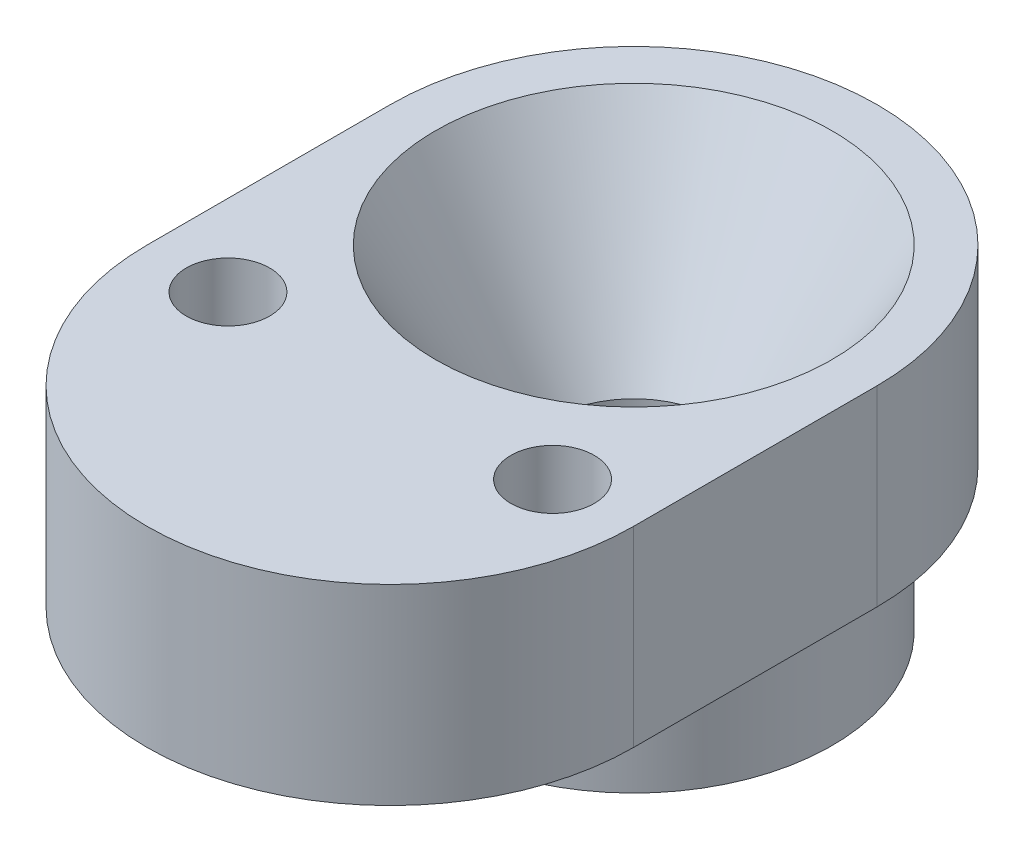
ISO-10303-21;
HEADER;
FILE_DESCRIPTION(('STEP AP214'),'2;1');
FILE_NAME('part.step','',(''),(''),'','','');
FILE_SCHEMA(('AUTOMOTIVE_DESIGN { 1 0 10303 214 1 1 1 1 }'));
ENDSEC;
DATA;
#1=APPLICATION_CONTEXT('core data for automotive mechanical design processes');
#2=APPLICATION_PROTOCOL_DEFINITION('international standard','automotive_design',2000,#1);
#3=PRODUCT_CONTEXT('',#1,'mechanical');
#4=PRODUCT('Part','Part','',(#3));
#5=PRODUCT_RELATED_PRODUCT_CATEGORY('part','',(#4));
#6=PRODUCT_DEFINITION_FORMATION('','',#4);
#7=PRODUCT_DEFINITION_CONTEXT('part definition',#1,'design');
#8=PRODUCT_DEFINITION('design','',#6,#7);
#9=PRODUCT_DEFINITION_SHAPE('','',#8);
#10=(LENGTH_UNIT() NAMED_UNIT(*) SI_UNIT(.MILLI.,.METRE.));
#11=(NAMED_UNIT(*) PLANE_ANGLE_UNIT() SI_UNIT($,.RADIAN.));
#12=(NAMED_UNIT(*) SI_UNIT($,.STERADIAN.) SOLID_ANGLE_UNIT());
#13=UNCERTAINTY_MEASURE_WITH_UNIT(LENGTH_MEASURE(1.E-05),#10,'distance_accuracy_value','');
#14=(GEOMETRIC_REPRESENTATION_CONTEXT(3) GLOBAL_UNCERTAINTY_ASSIGNED_CONTEXT((#13)) GLOBAL_UNIT_ASSIGNED_CONTEXT((#10,
#11,#12)) REPRESENTATION_CONTEXT('',''));
#15=CARTESIAN_POINT('',(0.,0.,0.));
#16=DIRECTION('',(0.,0.,1.));
#17=DIRECTION('',(1.,0.,0.));
#18=AXIS2_PLACEMENT_3D('',#15,#16,#17);
#19=CARTESIAN_POINT('',(0.,13.081000328064,14.2875001430511));
#20=DIRECTION('',(1.,0.,0.));
#21=DIRECTION('',(0.,0.,-1.));
#22=AXIS2_PLACEMENT_3D('',#19,#20,#21);
#23=PLANE('',#22);
#24=DIRECTION('',(0.,-1.,0.));
#25=VECTOR('',#24,1.);
#26=CARTESIAN_POINT('',(0.,13.081000328064,9.52500057220459));
#27=LINE('',#26,#25);
#28=CARTESIAN_POINT('',(0.,13.081000328064,9.52500057220459));
#29=VERTEX_POINT('',#28);
#30=CARTESIAN_POINT('',(0.,5.58800029754639,9.52500057220459));
#31=VERTEX_POINT('',#30);
#32=EDGE_CURVE('E89',#29,#31,#27,.T.);
#33=ORIENTED_EDGE('',*,*,#32,.T.);
#34=DIRECTION('',(0.,0.,1.));
#35=VECTOR('',#34,1.);
#36=CARTESIAN_POINT('',(0.,5.58800029754639,14.2875001430511));
#37=LINE('',#36,#35);
#38=CARTESIAN_POINT('',(0.,5.58800029754639,19.0500011444092));
#39=VERTEX_POINT('',#38);
#40=EDGE_CURVE('E51',#31,#39,#37,.T.);
#41=ORIENTED_EDGE('',*,*,#40,.T.);
#42=DIRECTION('',(0.,-1.,0.));
#43=VECTOR('',#42,1.);
#44=CARTESIAN_POINT('',(0.,13.081000328064,19.0500011444092));
#45=LINE('',#44,#43);
#46=CARTESIAN_POINT('',(0.,13.081000328064,19.0500011444092));
#47=VERTEX_POINT('',#46);
#48=EDGE_CURVE('E12',#47,#39,#45,.T.);
#49=ORIENTED_EDGE('',*,*,#48,.F.);
#50=DIRECTION('',(0.,0.,1.));
#51=VECTOR('',#50,1.);
#52=CARTESIAN_POINT('',(0.,13.081000328064,14.2875001430511));
#53=LINE('',#52,#51);
#54=EDGE_CURVE('E96',#29,#47,#53,.T.);
#55=ORIENTED_EDGE('',*,*,#54,.F.);
#56=EDGE_LOOP('',(#33,#41,#49,#55));
#57=FACE_BOUND('',#56,.T.);
#58=ADVANCED_FACE('F32',(#57),#23,.F.);
#59=CARTESIAN_POINT('',(9.52500057220459,13.081000328064,19.0499997138975));
#60=DIRECTION('',(0.,-1.,0.));
#61=DIRECTION('',(0.,0.,-1.));
#62=AXIS2_PLACEMENT_3D('',#59,#60,#61);
#63=CYLINDRICAL_SURFACE('',#62,9.5250005722047);
#64=ORIENTED_EDGE('',*,*,#48,.T.);
#65=CARTESIAN_POINT('',(9.52500057220459,5.58800029754639,19.0499997138975));
#66=DIRECTION('',(0.,1.,0.));
#67=DIRECTION('',(0.,0.,1.));
#68=AXIS2_PLACEMENT_3D('',#65,#66,#67);
#69=CIRCLE('',#68,9.5250005722047);
#70=CARTESIAN_POINT('',(19.0500011444092,5.58800029754639,19.0499982833858));
#71=VERTEX_POINT('',#70);
#72=EDGE_CURVE('E77',#39,#71,#69,.T.);
#73=ORIENTED_EDGE('',*,*,#72,.T.);
#74=DIRECTION('',(0.,-1.,0.));
#75=VECTOR('',#74,1.);
#76=CARTESIAN_POINT('',(19.0500011444092,13.081000328064,19.0499982833858));
#77=LINE('',#76,#75);
#78=CARTESIAN_POINT('',(19.0500011444092,13.081000328064,19.0499982833858));
#79=VERTEX_POINT('',#78);
#80=EDGE_CURVE('E43',#79,#71,#77,.T.);
#81=ORIENTED_EDGE('',*,*,#80,.F.);
#82=CARTESIAN_POINT('',(9.52500057220459,13.081000328064,19.0499997138975));
#83=DIRECTION('',(0.,1.,0.));
#84=DIRECTION('',(0.,0.,1.));
#85=AXIS2_PLACEMENT_3D('',#82,#83,#84);
#86=CIRCLE('',#85,9.5250005722047);
#87=EDGE_CURVE('E93',#47,#79,#86,.T.);
#88=ORIENTED_EDGE('',*,*,#87,.F.);
#89=EDGE_LOOP('',(#64,#73,#81,#88));
#90=FACE_BOUND('',#89,.T.);
#91=ADVANCED_FACE('F92',(#90),#63,.T.);
#92=CARTESIAN_POINT('',(19.0500011444092,13.081000328064,14.2875001430511));
#93=DIRECTION('',(1.,0.,0.));
#94=DIRECTION('',(0.,0.,-1.));
#95=AXIS2_PLACEMENT_3D('',#92,#93,#94);
#96=PLANE('',#95);
#97=DIRECTION('',(0.,0.,1.));
#98=VECTOR('',#97,1.);
#99=CARTESIAN_POINT('',(19.0500011444092,5.58800029754639,14.2875001430511));
#100=LINE('',#99,#98);
#101=CARTESIAN_POINT('',(19.0500011444092,5.58800029754639,9.52500057220459));
#102=VERTEX_POINT('',#101);
#103=EDGE_CURVE('E80',#102,#71,#100,.T.);
#104=ORIENTED_EDGE('',*,*,#103,.F.);
#105=DIRECTION('',(0.,-1.,0.));
#106=VECTOR('',#105,1.);
#107=CARTESIAN_POINT('',(19.0500011444092,13.081000328064,9.52500057220459));
#108=LINE('',#107,#106);
#109=CARTESIAN_POINT('',(19.0500011444092,13.081000328064,9.52500057220459));
#110=VERTEX_POINT('',#109);
#111=EDGE_CURVE('E113',#110,#102,#108,.T.);
#112=ORIENTED_EDGE('',*,*,#111,.F.);
#113=DIRECTION('',(0.,0.,1.));
#114=VECTOR('',#113,1.);
#115=CARTESIAN_POINT('',(19.0500011444092,13.081000328064,14.2875001430511));
#116=LINE('',#115,#114);
#117=EDGE_CURVE('E95',#110,#79,#116,.T.);
#118=ORIENTED_EDGE('',*,*,#117,.T.);
#119=ORIENTED_EDGE('',*,*,#80,.T.);
#120=EDGE_LOOP('',(#104,#112,#118,#119));
#121=FACE_BOUND('',#120,.T.);
#122=ADVANCED_FACE('F145',(#121),#96,.T.);
#123=CARTESIAN_POINT('',(3.17500061218221,13.081000328064,19.0499998539837));
#124=DIRECTION('',(0.,-1.,0.));
#125=DIRECTION('',(0.,0.,-1.));
#126=AXIS2_PLACEMENT_3D('',#123,#124,#125);
#127=CYLINDRICAL_SURFACE('',#126,1.63194955165494);
#128=CARTESIAN_POINT('',(3.17500061218221,5.58800029754639,19.0499998539837));
#129=DIRECTION('',(0.,1.,0.));
#130=DIRECTION('',(0.,0.,1.));
#131=AXIS2_PLACEMENT_3D('',#128,#129,#130);
#132=CIRCLE('',#131,1.63194955165494);
#133=CARTESIAN_POINT('',(3.17500061218221,5.58800029754639,20.6819494056386));
#134=VERTEX_POINT('',#133);
#135=EDGE_CURVE('E90',#134,#134,#132,.T.);
#136=ORIENTED_EDGE('',*,*,#135,.F.);
#137=EDGE_LOOP('',(#136));
#138=FACE_BOUND('',#137,.T.);
#139=CARTESIAN_POINT('',(3.17500061218221,13.081000328064,19.0499998539837));
#140=DIRECTION('',(0.,1.,0.));
#141=DIRECTION('',(0.,0.,1.));
#142=AXIS2_PLACEMENT_3D('',#139,#140,#141);
#143=CIRCLE('',#142,1.63194955165494);
#144=CARTESIAN_POINT('',(3.17500061218221,13.081000328064,20.6819494056386));
#145=VERTEX_POINT('',#144);
#146=EDGE_CURVE('E99',#145,#145,#143,.T.);
#147=ORIENTED_EDGE('',*,*,#146,.T.);
#148=EDGE_LOOP('',(#147));
#149=FACE_BOUND('',#148,.T.);
#150=ADVANCED_FACE('F148',(#138,#149),#127,.F.);
#151=CARTESIAN_POINT('',(15.8749997389301,13.081000328064,19.0500004056638));
#152=DIRECTION('',(0.,-1.,0.));
#153=DIRECTION('',(0.,0.,-1.));
#154=AXIS2_PLACEMENT_3D('',#151,#152,#153);
#155=CYLINDRICAL_SURFACE('',#154,1.6319497189058);
#156=CARTESIAN_POINT('',(15.8749997389301,5.58800029754639,19.0500004056638));
#157=DIRECTION('',(0.,1.,0.));
#158=DIRECTION('',(0.,0.,1.));
#159=AXIS2_PLACEMENT_3D('',#156,#157,#158);
#160=CIRCLE('',#159,1.6319497189058);
#161=CARTESIAN_POINT('',(15.8749997389301,5.58800029754639,20.6819501245696));
#162=VERTEX_POINT('',#161);
#163=EDGE_CURVE('E166',#162,#162,#160,.T.);
#164=ORIENTED_EDGE('',*,*,#163,.F.);
#165=EDGE_LOOP('',(#164));
#166=FACE_BOUND('',#165,.T.);
#167=CARTESIAN_POINT('',(15.8749997389301,13.081000328064,19.0500004056638));
#168=DIRECTION('',(0.,1.,0.));
#169=DIRECTION('',(0.,0.,1.));
#170=AXIS2_PLACEMENT_3D('',#167,#168,#169);
#171=CIRCLE('',#170,1.6319497189058);
#172=CARTESIAN_POINT('',(15.8749997389301,13.081000328064,20.6819501245696));
#173=VERTEX_POINT('',#172);
#174=EDGE_CURVE('E102',#173,#173,#171,.T.);
#175=ORIENTED_EDGE('',*,*,#174,.T.);
#176=EDGE_LOOP('',(#175));
#177=FACE_BOUND('',#176,.T.);
#178=ADVANCED_FACE('F155',(#166,#177),#155,.F.);
#179=CARTESIAN_POINT('',(9.52500057220459,13.081000328064,9.52500057220459));
#180=DIRECTION('',(0.,-1.,0.));
#181=DIRECTION('',(0.,0.,-1.));
#182=AXIS2_PLACEMENT_3D('',#179,#180,#181);
#183=CYLINDRICAL_SURFACE('',#182,3.23702389663491);
#184=CARTESIAN_POINT('',(9.52500057220459,5.58800029754639,9.52500057220459));
#185=DIRECTION('',(0.,-1.,0.));
#186=DIRECTION('',(0.,0.,-1.));
#187=AXIS2_PLACEMENT_3D('',#184,#185,#186);
#188=CIRCLE('',#187,3.23702389663491);
#189=CARTESIAN_POINT('',(9.52500057220459,5.58800029754639,6.28797667556968));
#190=VERTEX_POINT('',#189);
#191=EDGE_CURVE('E184',#190,#190,#188,.T.);
#192=ORIENTED_EDGE('',*,*,#191,.F.);
#193=EDGE_LOOP('',(#192));
#194=FACE_BOUND('',#193,.T.);
#195=CARTESIAN_POINT('',(9.52500057220459,0.,9.52500057220459));
#196=DIRECTION('',(0.,1.,0.));
#197=DIRECTION('',(0.,0.,1.));
#198=AXIS2_PLACEMENT_3D('',#195,#196,#197);
#199=CIRCLE('',#198,3.23702389663491);
#200=CARTESIAN_POINT('',(9.52500057220459,0.,12.7620244688395));
#201=VERTEX_POINT('',#200);
#202=EDGE_CURVE('E108',#201,#201,#199,.T.);
#203=ORIENTED_EDGE('',*,*,#202,.F.);
#204=EDGE_LOOP('',(#203));
#205=FACE_BOUND('',#204,.T.);
#206=ADVANCED_FACE('F34',(#194,#205),#183,.F.);
#207=CARTESIAN_POINT('',(9.52500057220459,13.081000328064,9.52500057220459));
#208=DIRECTION('',(0.,-1.,0.));
#209=DIRECTION('',(0.,0.,-1.));
#210=AXIS2_PLACEMENT_3D('',#207,#208,#209);
#211=CYLINDRICAL_SURFACE('',#210,9.52500057220459);
#212=ORIENTED_EDGE('',*,*,#111,.T.);
#213=CARTESIAN_POINT('',(9.52500057220459,5.58800029754639,9.52500057220459));
#214=DIRECTION('',(0.,1.,0.));
#215=DIRECTION('',(0.,0.,1.));
#216=AXIS2_PLACEMENT_3D('',#213,#214,#215);
#217=CIRCLE('',#216,9.52500057220459);
#218=EDGE_CURVE('E111',#102,#31,#217,.T.);
#219=ORIENTED_EDGE('',*,*,#218,.T.);
#220=ORIENTED_EDGE('',*,*,#32,.F.);
#221=CARTESIAN_POINT('',(9.52500057220459,13.081000328064,9.52500057220459));
#222=DIRECTION('',(0.,1.,0.));
#223=DIRECTION('',(0.,0.,1.));
#224=AXIS2_PLACEMENT_3D('',#221,#222,#223);
#225=CIRCLE('',#224,9.52500057220459);
#226=EDGE_CURVE('E59',#110,#29,#225,.T.);
#227=ORIENTED_EDGE('',*,*,#226,.F.);
#228=EDGE_LOOP('',(#212,#219,#220,#227));
#229=FACE_BOUND('',#228,.T.);
#230=ADVANCED_FACE('F136',(#229),#211,.T.);
#231=CARTESIAN_POINT('',(-17.3289099397892,13.081000328064,14.2875001430511));
#232=DIRECTION('',(0.,1.,0.));
#233=DIRECTION('',(0.,0.,1.));
#234=AXIS2_PLACEMENT_3D('',#231,#232,#233);
#235=PLANE('',#234);
#236=CARTESIAN_POINT('',(9.52500057220459,13.081000328064,9.52500057220459));
#237=DIRECTION('',(0.,1.,0.));
#238=DIRECTION('',(0.,0.,1.));
#239=AXIS2_PLACEMENT_3D('',#236,#237,#238);
#240=CIRCLE('',#239,7.75893848857634);
#241=CARTESIAN_POINT('',(9.52500057220459,13.081000328064,17.2839390607809));
#242=VERTEX_POINT('',#241);
#243=EDGE_CURVE('E121',#242,#242,#240,.T.);
#244=ORIENTED_EDGE('',*,*,#243,.F.);
#245=EDGE_LOOP('',(#244));
#246=FACE_BOUND('',#245,.T.);
#247=ORIENTED_EDGE('',*,*,#174,.F.);
#248=EDGE_LOOP('',(#247));
#249=FACE_BOUND('',#248,.T.);
#250=ORIENTED_EDGE('',*,*,#146,.F.);
#251=EDGE_LOOP('',(#250));
#252=FACE_BOUND('',#251,.T.);
#253=ORIENTED_EDGE('',*,*,#54,.T.);
#254=ORIENTED_EDGE('',*,*,#87,.T.);
#255=ORIENTED_EDGE('',*,*,#117,.F.);
#256=ORIENTED_EDGE('',*,*,#226,.T.);
#257=EDGE_LOOP('',(#253,#254,#255,#256));
#258=FACE_BOUND('',#257,.T.);
#259=ADVANCED_FACE('F98',(#246,#249,#252,#258),#235,.T.);
#260=CARTESIAN_POINT('',(-17.3289099397892,0.,14.2875001430511));
#261=DIRECTION('',(0.,1.,0.));
#262=DIRECTION('',(0.,0.,1.));
#263=AXIS2_PLACEMENT_3D('',#260,#261,#262);
#264=PLANE('',#263);
#265=CARTESIAN_POINT('',(9.52500057220459,0.,9.52500057220459));
#266=DIRECTION('',(0.,1.,0.));
#267=DIRECTION('',(0.,0.,1.));
#268=AXIS2_PLACEMENT_3D('',#265,#266,#267);
#269=CIRCLE('',#268,7.75893848857634);
#270=CARTESIAN_POINT('',(9.52500057220459,0.,17.2839390607809));
#271=VERTEX_POINT('',#270);
#272=EDGE_CURVE('E171',#271,#271,#269,.T.);
#273=ORIENTED_EDGE('',*,*,#272,.F.);
#274=EDGE_LOOP('',(#273));
#275=FACE_BOUND('',#274,.T.);
#276=ORIENTED_EDGE('',*,*,#202,.T.);
#277=EDGE_LOOP('',(#276));
#278=FACE_BOUND('',#277,.T.);
#279=ADVANCED_FACE('F135',(#275,#278),#264,.F.);
#280=CARTESIAN_POINT('',(9.52500057220459,5.58800029754639,9.52500057220459));
#281=DIRECTION('',(0.,-1.,0.));
#282=DIRECTION('',(0.,0.,-1.));
#283=AXIS2_PLACEMENT_3D('',#280,#281,#282);
#284=CYLINDRICAL_SURFACE('',#283,7.75893848857634);
#285=CARTESIAN_POINT('',(9.52500057220459,5.58800029754639,9.52500057220459));
#286=DIRECTION('',(0.,1.,0.));
#287=DIRECTION('',(0.,0.,1.));
#288=AXIS2_PLACEMENT_3D('',#285,#286,#287);
#289=CIRCLE('',#288,7.75893848857634);
#290=CARTESIAN_POINT('',(9.52500057220459,5.58800029754639,17.2839390607809));
#291=VERTEX_POINT('',#290);
#292=EDGE_CURVE('E174',#291,#291,#289,.T.);
#293=ORIENTED_EDGE('',*,*,#292,.F.);
#294=EDGE_LOOP('',(#293));
#295=FACE_BOUND('',#294,.T.);
#296=ORIENTED_EDGE('',*,*,#272,.T.);
#297=EDGE_LOOP('',(#296));
#298=FACE_BOUND('',#297,.T.);
#299=ADVANCED_FACE('F137',(#295,#298),#284,.T.);
#300=CARTESIAN_POINT('',(-17.3289099397892,5.58800029754639,14.2875001430511));
#301=DIRECTION('',(0.,1.,0.));
#302=DIRECTION('',(0.,0.,1.));
#303=AXIS2_PLACEMENT_3D('',#300,#301,#302);
#304=PLANE('',#303);
#305=ORIENTED_EDGE('',*,*,#292,.T.);
#306=EDGE_LOOP('',(#305));
#307=FACE_BOUND('',#306,.T.);
#308=ORIENTED_EDGE('',*,*,#163,.T.);
#309=EDGE_LOOP('',(#308));
#310=FACE_BOUND('',#309,.T.);
#311=ORIENTED_EDGE('',*,*,#135,.T.);
#312=EDGE_LOOP('',(#311));
#313=FACE_BOUND('',#312,.T.);
#314=ORIENTED_EDGE('',*,*,#40,.F.);
#315=ORIENTED_EDGE('',*,*,#218,.F.);
#316=ORIENTED_EDGE('',*,*,#103,.T.);
#317=ORIENTED_EDGE('',*,*,#72,.F.);
#318=EDGE_LOOP('',(#314,#315,#316,#317));
#319=FACE_BOUND('',#318,.T.);
#320=ADVANCED_FACE('F78',(#307,#310,#313,#319),#304,.F.);
#321=CARTESIAN_POINT('',(9.52500057220459,5.58800029754639,9.52500057220459));
#322=DIRECTION('',(0.,1.,0.));
#323=DIRECTION('',(0.,0.,1.));
#324=AXIS2_PLACEMENT_3D('',#321,#322,#323);
#325=CONICAL_SURFACE('',#324,3.23702389663491,0.542978204556482);
#326=ORIENTED_EDGE('',*,*,#243,.T.);
#327=EDGE_LOOP('',(#326));
#328=FACE_BOUND('',#327,.T.);
#329=ORIENTED_EDGE('',*,*,#191,.T.);
#330=EDGE_LOOP('',(#329));
#331=FACE_BOUND('',#330,.T.);
#332=ADVANCED_FACE('F195',(#328,#331),#325,.F.);
#333=CLOSED_SHELL('',(#58,#91,#122,#150,#178,#206,#230,#259,#279,#299,#320,#332));
#334=MANIFOLD_SOLID_BREP('B2',#333);
#335=ADVANCED_BREP_SHAPE_REPRESENTATION('',(#18,#334),#14);
#336=SHAPE_DEFINITION_REPRESENTATION(#9,#335);
ENDSEC;
END-ISO-10303-21;
